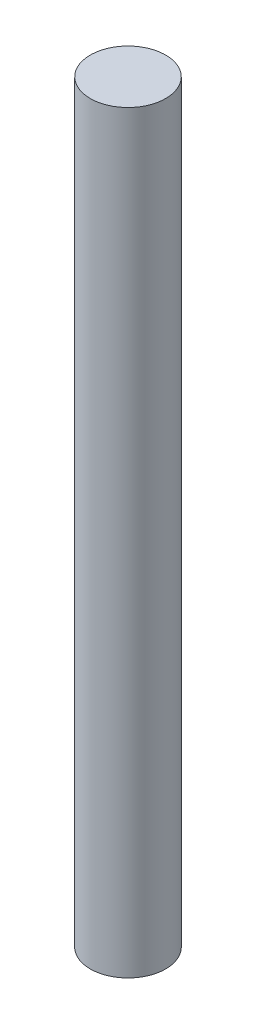
ISO-10303-21;
HEADER;
FILE_DESCRIPTION(('STEP AP214'),'2;1');
FILE_NAME('part.step','',(''),(''),'','','');
FILE_SCHEMA(('AUTOMOTIVE_DESIGN { 1 0 10303 214 1 1 1 1 }'));
ENDSEC;
DATA;
#1=APPLICATION_CONTEXT('core data for automotive mechanical design processes');
#2=APPLICATION_PROTOCOL_DEFINITION('international standard','automotive_design',2000,#1);
#3=PRODUCT_CONTEXT('',#1,'mechanical');
#4=PRODUCT('Part','Part','',(#3));
#5=PRODUCT_RELATED_PRODUCT_CATEGORY('part','',(#4));
#6=PRODUCT_DEFINITION_FORMATION('','',#4);
#7=PRODUCT_DEFINITION_CONTEXT('part definition',#1,'design');
#8=PRODUCT_DEFINITION('design','',#6,#7);
#9=PRODUCT_DEFINITION_SHAPE('','',#8);
#10=(LENGTH_UNIT() NAMED_UNIT(*) SI_UNIT(.MILLI.,.METRE.));
#11=(NAMED_UNIT(*) PLANE_ANGLE_UNIT() SI_UNIT($,.RADIAN.));
#12=(NAMED_UNIT(*) SI_UNIT($,.STERADIAN.) SOLID_ANGLE_UNIT());
#13=UNCERTAINTY_MEASURE_WITH_UNIT(LENGTH_MEASURE(1.E-05),#10,'distance_accuracy_value','');
#14=(GEOMETRIC_REPRESENTATION_CONTEXT(3) GLOBAL_UNCERTAINTY_ASSIGNED_CONTEXT((#13)) GLOBAL_UNIT_ASSIGNED_CONTEXT((#10,
#11,#12)) REPRESENTATION_CONTEXT('',''));
#15=CARTESIAN_POINT('',(0.,0.,0.));
#16=DIRECTION('',(0.,0.,1.));
#17=DIRECTION('',(1.,0.,0.));
#18=AXIS2_PLACEMENT_3D('',#15,#16,#17);
#19=CARTESIAN_POINT('',(0.,7.,0.));
#20=DIRECTION('',(0.,-1.,0.));
#21=DIRECTION('',(0.,0.,-1.));
#22=AXIS2_PLACEMENT_3D('',#19,#20,#21);
#23=CYLINDRICAL_SURFACE('',#22,0.35);
#24=CARTESIAN_POINT('',(0.,7.,0.));
#25=DIRECTION('',(0.,1.,0.));
#26=DIRECTION('',(0.,0.,1.));
#27=AXIS2_PLACEMENT_3D('',#24,#25,#26);
#28=CIRCLE('',#27,0.35);
#29=CARTESIAN_POINT('',(0.,7.,0.35));
#30=VERTEX_POINT('',#29);
#31=EDGE_CURVE('E10',#30,#30,#28,.T.);
#32=ORIENTED_EDGE('',*,*,#31,.F.);
#33=EDGE_LOOP('',(#32));
#34=FACE_BOUND('',#33,.T.);
#35=CARTESIAN_POINT('',(0.,0.,0.));
#36=DIRECTION('',(0.,1.,0.));
#37=DIRECTION('',(0.,0.,1.));
#38=AXIS2_PLACEMENT_3D('',#35,#36,#37);
#39=CIRCLE('',#38,0.35);
#40=CARTESIAN_POINT('',(0.,0.,0.35));
#41=VERTEX_POINT('',#40);
#42=EDGE_CURVE('E34',#41,#41,#39,.T.);
#43=ORIENTED_EDGE('',*,*,#42,.T.);
#44=EDGE_LOOP('',(#43));
#45=FACE_BOUND('',#44,.T.);
#46=ADVANCED_FACE('F31',(#34,#45),#23,.T.);
#47=CARTESIAN_POINT('',(0.,7.,0.));
#48=DIRECTION('',(0.,1.,0.));
#49=DIRECTION('',(0.,0.,1.));
#50=AXIS2_PLACEMENT_3D('',#47,#48,#49);
#51=PLANE('',#50);
#52=ORIENTED_EDGE('',*,*,#31,.T.);
#53=EDGE_LOOP('',(#52));
#54=FACE_BOUND('',#53,.T.);
#55=ADVANCED_FACE('F46',(#54),#51,.T.);
#56=CARTESIAN_POINT('',(0.,0.,0.));
#57=DIRECTION('',(0.,1.,0.));
#58=DIRECTION('',(0.,0.,1.));
#59=AXIS2_PLACEMENT_3D('',#56,#57,#58);
#60=PLANE('',#59);
#61=ORIENTED_EDGE('',*,*,#42,.F.);
#62=EDGE_LOOP('',(#61));
#63=FACE_BOUND('',#62,.T.);
#64=ADVANCED_FACE('F44',(#63),#60,.F.);
#65=CLOSED_SHELL('',(#46,#55,#64));
#66=MANIFOLD_SOLID_BREP('B2',#65);
#67=ADVANCED_BREP_SHAPE_REPRESENTATION('',(#18,#66),#14);
#68=SHAPE_DEFINITION_REPRESENTATION(#9,#67);
ENDSEC;
END-ISO-10303-21;
